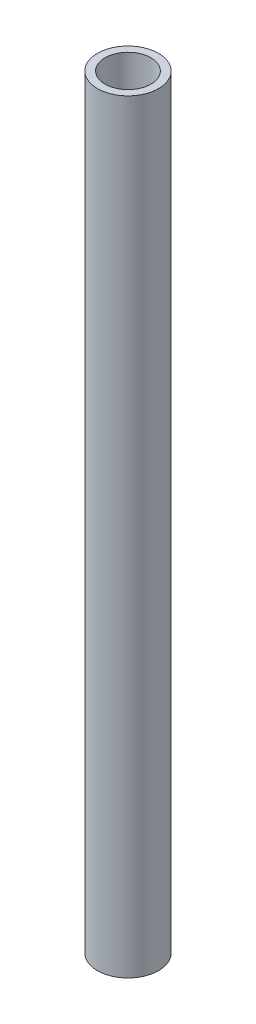
ISO-10303-21;
HEADER;
FILE_DESCRIPTION(('STEP AP214'),'2;1');
FILE_NAME('part.step','',(''),(''),'','','');
FILE_SCHEMA(('AUTOMOTIVE_DESIGN { 1 0 10303 214 1 1 1 1 }'));
ENDSEC;
DATA;
#1=APPLICATION_CONTEXT('core data for automotive mechanical design processes');
#2=APPLICATION_PROTOCOL_DEFINITION('international standard','automotive_design',2000,#1);
#3=PRODUCT_CONTEXT('',#1,'mechanical');
#4=PRODUCT('Part','Part','',(#3));
#5=PRODUCT_RELATED_PRODUCT_CATEGORY('part','',(#4));
#6=PRODUCT_DEFINITION_FORMATION('','',#4);
#7=PRODUCT_DEFINITION_CONTEXT('part definition',#1,'design');
#8=PRODUCT_DEFINITION('design','',#6,#7);
#9=PRODUCT_DEFINITION_SHAPE('','',#8);
#10=(LENGTH_UNIT() NAMED_UNIT(*) SI_UNIT(.MILLI.,.METRE.));
#11=(NAMED_UNIT(*) PLANE_ANGLE_UNIT() SI_UNIT($,.RADIAN.));
#12=(NAMED_UNIT(*) SI_UNIT($,.STERADIAN.) SOLID_ANGLE_UNIT());
#13=UNCERTAINTY_MEASURE_WITH_UNIT(LENGTH_MEASURE(1.E-05),#10,'distance_accuracy_value','');
#14=(GEOMETRIC_REPRESENTATION_CONTEXT(3) GLOBAL_UNCERTAINTY_ASSIGNED_CONTEXT((#13)) GLOBAL_UNIT_ASSIGNED_CONTEXT((#10,
#11,#12)) REPRESENTATION_CONTEXT('',''));
#15=CARTESIAN_POINT('',(0.,0.,0.));
#16=DIRECTION('',(0.,0.,1.));
#17=DIRECTION('',(1.,0.,0.));
#18=AXIS2_PLACEMENT_3D('',#15,#16,#17);
#19=CARTESIAN_POINT('',(0.,100.,0.));
#20=DIRECTION('',(0.,1.,0.));
#21=DIRECTION('',(0.,0.,1.));
#22=AXIS2_PLACEMENT_3D('',#19,#20,#21);
#23=PLANE('',#22);
#24=CARTESIAN_POINT('',(0.,100.,0.));
#25=DIRECTION('',(0.,1.,0.));
#26=DIRECTION('',(0.,0.,1.));
#27=AXIS2_PLACEMENT_3D('',#24,#25,#26);
#28=CIRCLE('',#27,4.);
#29=CARTESIAN_POINT('',(0.,100.,4.));
#30=VERTEX_POINT('',#29);
#31=EDGE_CURVE('E10',#30,#30,#28,.T.);
#32=ORIENTED_EDGE('',*,*,#31,.T.);
#33=EDGE_LOOP('',(#32));
#34=FACE_BOUND('',#33,.T.);
#35=CARTESIAN_POINT('',(0.,100.,0.));
#36=DIRECTION('',(0.,1.,0.));
#37=DIRECTION('',(0.,0.,1.));
#38=AXIS2_PLACEMENT_3D('',#35,#36,#37);
#39=CIRCLE('',#38,3.);
#40=CARTESIAN_POINT('',(0.,100.,3.));
#41=VERTEX_POINT('',#40);
#42=EDGE_CURVE('E44',#41,#41,#39,.T.);
#43=ORIENTED_EDGE('',*,*,#42,.F.);
#44=EDGE_LOOP('',(#43));
#45=FACE_BOUND('',#44,.T.);
#46=ADVANCED_FACE('F33',(#34,#45),#23,.T.);
#47=CARTESIAN_POINT('',(0.,0.,0.));
#48=DIRECTION('',(0.,1.,0.));
#49=DIRECTION('',(0.,0.,1.));
#50=AXIS2_PLACEMENT_3D('',#47,#48,#49);
#51=PLANE('',#50);
#52=CARTESIAN_POINT('',(0.,0.,0.));
#53=DIRECTION('',(0.,1.,0.));
#54=DIRECTION('',(0.,0.,1.));
#55=AXIS2_PLACEMENT_3D('',#52,#53,#54);
#56=CIRCLE('',#55,4.);
#57=CARTESIAN_POINT('',(0.,0.,4.));
#58=VERTEX_POINT('',#57);
#59=EDGE_CURVE('E37',#58,#58,#56,.T.);
#60=ORIENTED_EDGE('',*,*,#59,.F.);
#61=EDGE_LOOP('',(#60));
#62=FACE_BOUND('',#61,.T.);
#63=CARTESIAN_POINT('',(0.,0.,0.));
#64=DIRECTION('',(0.,1.,0.));
#65=DIRECTION('',(0.,0.,1.));
#66=AXIS2_PLACEMENT_3D('',#63,#64,#65);
#67=CIRCLE('',#66,3.);
#68=CARTESIAN_POINT('',(0.,0.,3.));
#69=VERTEX_POINT('',#68);
#70=EDGE_CURVE('E46',#69,#69,#67,.T.);
#71=ORIENTED_EDGE('',*,*,#70,.T.);
#72=EDGE_LOOP('',(#71));
#73=FACE_BOUND('',#72,.T.);
#74=ADVANCED_FACE('F56',(#62,#73),#51,.F.);
#75=CARTESIAN_POINT('',(0.,100.,0.));
#76=DIRECTION('',(0.,-1.,0.));
#77=DIRECTION('',(0.,0.,-1.));
#78=AXIS2_PLACEMENT_3D('',#75,#76,#77);
#79=CYLINDRICAL_SURFACE('',#78,4.);
#80=ORIENTED_EDGE('',*,*,#31,.F.);
#81=EDGE_LOOP('',(#80));
#82=FACE_BOUND('',#81,.T.);
#83=ORIENTED_EDGE('',*,*,#59,.T.);
#84=EDGE_LOOP('',(#83));
#85=FACE_BOUND('',#84,.T.);
#86=ADVANCED_FACE('F35',(#82,#85),#79,.T.);
#87=CARTESIAN_POINT('',(0.,100.,0.));
#88=DIRECTION('',(0.,-1.,0.));
#89=DIRECTION('',(0.,0.,-1.));
#90=AXIS2_PLACEMENT_3D('',#87,#88,#89);
#91=CYLINDRICAL_SURFACE('',#90,3.);
#92=ORIENTED_EDGE('',*,*,#42,.T.);
#93=EDGE_LOOP('',(#92));
#94=FACE_BOUND('',#93,.T.);
#95=ORIENTED_EDGE('',*,*,#70,.F.);
#96=EDGE_LOOP('',(#95));
#97=FACE_BOUND('',#96,.T.);
#98=ADVANCED_FACE('F52',(#94,#97),#91,.F.);
#99=CLOSED_SHELL('',(#46,#74,#86,#98));
#100=MANIFOLD_SOLID_BREP('B2',#99);
#101=ADVANCED_BREP_SHAPE_REPRESENTATION('',(#18,#100),#14);
#102=SHAPE_DEFINITION_REPRESENTATION(#9,#101);
ENDSEC;
END-ISO-10303-21;
